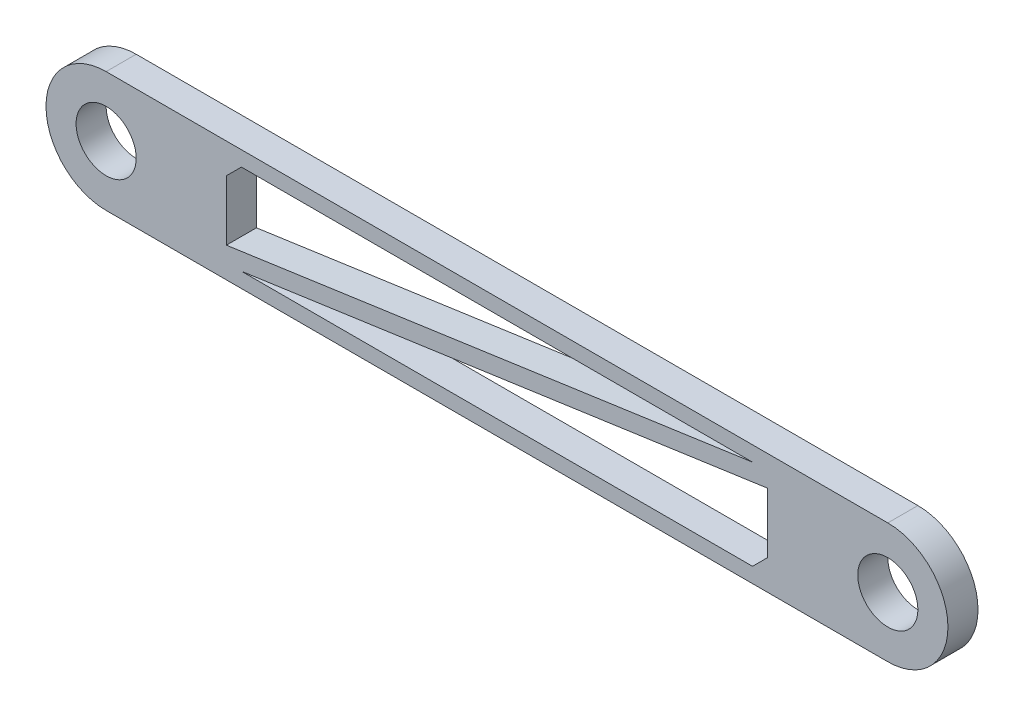
ISO-10303-21;
HEADER;
FILE_DESCRIPTION(('STEP AP214'),'2;1');
FILE_NAME('part.step','',(''),(''),'','','');
FILE_SCHEMA(('AUTOMOTIVE_DESIGN { 1 0 10303 214 1 1 1 1 }'));
ENDSEC;
DATA;
#1=APPLICATION_CONTEXT('core data for automotive mechanical design processes');
#2=APPLICATION_PROTOCOL_DEFINITION('international standard','automotive_design',2000,#1);
#3=PRODUCT_CONTEXT('',#1,'mechanical');
#4=PRODUCT('Part','Part','',(#3));
#5=PRODUCT_RELATED_PRODUCT_CATEGORY('part','',(#4));
#6=PRODUCT_DEFINITION_FORMATION('','',#4);
#7=PRODUCT_DEFINITION_CONTEXT('part definition',#1,'design');
#8=PRODUCT_DEFINITION('design','',#6,#7);
#9=PRODUCT_DEFINITION_SHAPE('','',#8);
#10=(LENGTH_UNIT() NAMED_UNIT(*) SI_UNIT(.MILLI.,.METRE.));
#11=(NAMED_UNIT(*) PLANE_ANGLE_UNIT() SI_UNIT($,.RADIAN.));
#12=(NAMED_UNIT(*) SI_UNIT($,.STERADIAN.) SOLID_ANGLE_UNIT());
#13=UNCERTAINTY_MEASURE_WITH_UNIT(LENGTH_MEASURE(1.E-05),#10,'distance_accuracy_value','');
#14=(GEOMETRIC_REPRESENTATION_CONTEXT(3) GLOBAL_UNCERTAINTY_ASSIGNED_CONTEXT((#13)) GLOBAL_UNIT_ASSIGNED_CONTEXT((#10,
#11,#12)) REPRESENTATION_CONTEXT('',''));
#15=CARTESIAN_POINT('',(0.,0.,0.));
#16=DIRECTION('',(0.,0.,1.));
#17=DIRECTION('',(1.,0.,0.));
#18=AXIS2_PLACEMENT_3D('',#15,#16,#17);
#19=CARTESIAN_POINT('',(-130.,0.,10.));
#20=DIRECTION('',(0.,0.,1.));
#21=DIRECTION('',(1.,0.,0.));
#22=AXIS2_PLACEMENT_3D('',#19,#20,#21);
#23=PLANE('',#22);
#24=CARTESIAN_POINT('',(130.,0.,10.));
#25=DIRECTION('',(0.,0.,1.));
#26=DIRECTION('',(1.,0.,0.));
#27=AXIS2_PLACEMENT_3D('',#24,#25,#26);
#28=CIRCLE('',#27,10.);
#29=CARTESIAN_POINT('',(140.,0.,10.));
#30=VERTEX_POINT('',#29);
#31=EDGE_CURVE('E159',#30,#30,#28,.T.);
#32=ORIENTED_EDGE('',*,*,#31,.F.);
#33=EDGE_LOOP('',(#32));
#34=FACE_BOUND('',#33,.T.);
#35=CARTESIAN_POINT('',(-130.,0.,10.));
#36=DIRECTION('',(0.,0.,1.));
#37=DIRECTION('',(1.,0.,0.));
#38=AXIS2_PLACEMENT_3D('',#35,#36,#37);
#39=CIRCLE('',#38,20.);
#40=CARTESIAN_POINT('',(-130.,20.,10.));
#41=VERTEX_POINT('',#40);
#42=CARTESIAN_POINT('',(-130.,-20.,10.));
#43=VERTEX_POINT('',#42);
#44=EDGE_CURVE('E200',#41,#43,#39,.T.);
#45=ORIENTED_EDGE('',*,*,#44,.T.);
#46=DIRECTION('',(1.,0.,0.));
#47=VECTOR('',#46,1.);
#48=CARTESIAN_POINT('',(-130.,-20.,10.));
#49=LINE('',#48,#47);
#50=CARTESIAN_POINT('',(130.,-20.,10.));
#51=VERTEX_POINT('',#50);
#52=EDGE_CURVE('E203',#43,#51,#49,.T.);
#53=ORIENTED_EDGE('',*,*,#52,.T.);
#54=CARTESIAN_POINT('',(130.,0.,10.));
#55=DIRECTION('',(0.,0.,1.));
#56=DIRECTION('',(1.,0.,0.));
#57=AXIS2_PLACEMENT_3D('',#54,#55,#56);
#58=CIRCLE('',#57,20.);
#59=CARTESIAN_POINT('',(130.,20.,10.));
#60=VERTEX_POINT('',#59);
#61=EDGE_CURVE('E206',#51,#60,#58,.T.);
#62=ORIENTED_EDGE('',*,*,#61,.T.);
#63=DIRECTION('',(-1.,0.,0.));
#64=VECTOR('',#63,1.);
#65=CARTESIAN_POINT('',(-130.,20.,10.));
#66=LINE('',#65,#64);
#67=EDGE_CURVE('E208',#60,#41,#66,.T.);
#68=ORIENTED_EDGE('',*,*,#67,.T.);
#69=EDGE_LOOP('',(#45,#53,#62,#68));
#70=FACE_BOUND('',#69,.T.);
#71=DIRECTION('',(0.989949493661167,0.141421356237309,0.));
#72=VECTOR('',#71,1.);
#73=CARTESIAN_POINT('',(85.,15.,10.));
#74=LINE('',#73,#72);
#75=CARTESIAN_POINT('',(-90.0000000000001,-10.,10.));
#76=VERTEX_POINT('',#75);
#77=CARTESIAN_POINT('',(85.,15.,10.));
#78=VERTEX_POINT('',#77);
#79=EDGE_CURVE('E171',#76,#78,#74,.T.);
#80=ORIENTED_EDGE('',*,*,#79,.F.);
#81=DIRECTION('',(0.,-1.,0.));
#82=VECTOR('',#81,1.);
#83=CARTESIAN_POINT('',(-90.0000000000001,-10.,10.));
#84=LINE('',#83,#82);
#85=CARTESIAN_POINT('',(-90.0000000000001,9.99999999999999,10.));
#86=VERTEX_POINT('',#85);
#87=EDGE_CURVE('E169',#86,#76,#84,.T.);
#88=ORIENTED_EDGE('',*,*,#87,.F.);
#89=DIRECTION('',(-0.707106781186548,-0.707106781186547,0.));
#90=VECTOR('',#89,1.);
#91=CARTESIAN_POINT('',(-90.0000000000001,9.99999999999999,10.));
#92=LINE('',#91,#90);
#93=CARTESIAN_POINT('',(-85.,15.,10.));
#94=VERTEX_POINT('',#93);
#95=EDGE_CURVE('E177',#94,#86,#92,.T.);
#96=ORIENTED_EDGE('',*,*,#95,.F.);
#97=DIRECTION('',(-1.,0.,0.));
#98=VECTOR('',#97,1.);
#99=CARTESIAN_POINT('',(-85.,15.,10.));
#100=LINE('',#99,#98);
#101=EDGE_CURVE('E174',#78,#94,#100,.T.);
#102=ORIENTED_EDGE('',*,*,#101,.F.);
#103=EDGE_LOOP('',(#80,#88,#96,#102));
#104=FACE_BOUND('',#103,.T.);
#105=DIRECTION('',(1.,0.,0.));
#106=VECTOR('',#105,1.);
#107=CARTESIAN_POINT('',(-85.,-15.,10.));
#108=LINE('',#107,#106);
#109=CARTESIAN_POINT('',(-85.,-15.,10.));
#110=VERTEX_POINT('',#109);
#111=CARTESIAN_POINT('',(85.,-15.,10.));
#112=VERTEX_POINT('',#111);
#113=EDGE_CURVE('E138',#110,#112,#108,.T.);
#114=ORIENTED_EDGE('',*,*,#113,.F.);
#115=DIRECTION('',(-0.989949493661167,-0.141421356237309,0.));
#116=VECTOR('',#115,1.);
#117=CARTESIAN_POINT('',(-85.,-15.,10.));
#118=LINE('',#117,#116);
#119=CARTESIAN_POINT('',(90.,9.99999999999999,10.));
#120=VERTEX_POINT('',#119);
#121=EDGE_CURVE('E130',#120,#110,#118,.T.);
#122=ORIENTED_EDGE('',*,*,#121,.F.);
#123=DIRECTION('',(0.,1.,0.));
#124=VECTOR('',#123,1.);
#125=CARTESIAN_POINT('',(90.,-10.,10.));
#126=LINE('',#125,#124);
#127=CARTESIAN_POINT('',(90.,-10.,10.));
#128=VERTEX_POINT('',#127);
#129=EDGE_CURVE('E153',#128,#120,#126,.T.);
#130=ORIENTED_EDGE('',*,*,#129,.F.);
#131=DIRECTION('',(0.707106781186548,0.707106781186547,0.));
#132=VECTOR('',#131,1.);
#133=CARTESIAN_POINT('',(85.,-15.,10.));
#134=LINE('',#133,#132);
#135=EDGE_CURVE('E151',#112,#128,#134,.T.);
#136=ORIENTED_EDGE('',*,*,#135,.F.);
#137=EDGE_LOOP('',(#114,#122,#130,#136));
#138=FACE_BOUND('',#137,.T.);
#139=CARTESIAN_POINT('',(-130.,0.,10.));
#140=DIRECTION('',(0.,0.,1.));
#141=DIRECTION('',(1.,0.,0.));
#142=AXIS2_PLACEMENT_3D('',#139,#140,#141);
#143=CIRCLE('',#142,9.99999999999999);
#144=CARTESIAN_POINT('',(-120.,0.,10.));
#145=VERTEX_POINT('',#144);
#146=EDGE_CURVE('E317',#145,#145,#143,.T.);
#147=ORIENTED_EDGE('',*,*,#146,.F.);
#148=EDGE_LOOP('',(#147));
#149=FACE_BOUND('',#148,.T.);
#150=ADVANCED_FACE('F41',(#34,#70,#104,#138,#149),#23,.T.);
#151=CARTESIAN_POINT('',(-130.,0.,0.));
#152=DIRECTION('',(0.,0.,1.));
#153=DIRECTION('',(1.,0.,0.));
#154=AXIS2_PLACEMENT_3D('',#151,#152,#153);
#155=PLANE('',#154);
#156=DIRECTION('',(0.,-1.,0.));
#157=VECTOR('',#156,1.);
#158=CARTESIAN_POINT('',(-90.0000000000001,-10.,0.));
#159=LINE('',#158,#157);
#160=CARTESIAN_POINT('',(-90.0000000000001,10.,0.));
#161=VERTEX_POINT('',#160);
#162=CARTESIAN_POINT('',(-90.0000000000001,-10.,0.));
#163=VERTEX_POINT('',#162);
#164=EDGE_CURVE('E146',#161,#163,#159,.T.);
#165=ORIENTED_EDGE('',*,*,#164,.T.);
#166=DIRECTION('',(0.989949493661167,0.141421356237309,0.));
#167=VECTOR('',#166,1.);
#168=CARTESIAN_POINT('',(85.,15.,0.));
#169=LINE('',#168,#167);
#170=CARTESIAN_POINT('',(85.,15.,0.));
#171=VERTEX_POINT('',#170);
#172=EDGE_CURVE('E182',#163,#171,#169,.T.);
#173=ORIENTED_EDGE('',*,*,#172,.T.);
#174=DIRECTION('',(-1.,0.,0.));
#175=VECTOR('',#174,1.);
#176=CARTESIAN_POINT('',(-85.,15.,0.));
#177=LINE('',#176,#175);
#178=CARTESIAN_POINT('',(-85.,15.,0.));
#179=VERTEX_POINT('',#178);
#180=EDGE_CURVE('E185',#171,#179,#177,.T.);
#181=ORIENTED_EDGE('',*,*,#180,.T.);
#182=DIRECTION('',(-0.707106781186548,-0.707106781186547,0.));
#183=VECTOR('',#182,1.);
#184=CARTESIAN_POINT('',(-90.0000000000001,9.99999999999999,0.));
#185=LINE('',#184,#183);
#186=EDGE_CURVE('E172',#179,#161,#185,.T.);
#187=ORIENTED_EDGE('',*,*,#186,.T.);
#188=EDGE_LOOP('',(#165,#173,#181,#187));
#189=FACE_BOUND('',#188,.T.);
#190=CARTESIAN_POINT('',(-130.,0.,0.));
#191=DIRECTION('',(0.,0.,1.));
#192=DIRECTION('',(1.,0.,0.));
#193=AXIS2_PLACEMENT_3D('',#190,#191,#192);
#194=CIRCLE('',#193,20.);
#195=CARTESIAN_POINT('',(-130.,20.,0.));
#196=VERTEX_POINT('',#195);
#197=CARTESIAN_POINT('',(-130.,-20.,0.));
#198=VERTEX_POINT('',#197);
#199=EDGE_CURVE('E199',#196,#198,#194,.T.);
#200=ORIENTED_EDGE('',*,*,#199,.F.);
#201=DIRECTION('',(-1.,0.,0.));
#202=VECTOR('',#201,1.);
#203=CARTESIAN_POINT('',(-130.,20.,0.));
#204=LINE('',#203,#202);
#205=CARTESIAN_POINT('',(130.,20.,0.));
#206=VERTEX_POINT('',#205);
#207=EDGE_CURVE('E204',#206,#196,#204,.T.);
#208=ORIENTED_EDGE('',*,*,#207,.F.);
#209=CARTESIAN_POINT('',(130.,0.,0.));
#210=DIRECTION('',(0.,0.,1.));
#211=DIRECTION('',(1.,0.,0.));
#212=AXIS2_PLACEMENT_3D('',#209,#210,#211);
#213=CIRCLE('',#212,20.);
#214=CARTESIAN_POINT('',(130.,-20.,0.));
#215=VERTEX_POINT('',#214);
#216=EDGE_CURVE('E215',#215,#206,#213,.T.);
#217=ORIENTED_EDGE('',*,*,#216,.F.);
#218=DIRECTION('',(1.,0.,0.));
#219=VECTOR('',#218,1.);
#220=CARTESIAN_POINT('',(-130.,-20.,0.));
#221=LINE('',#220,#219);
#222=EDGE_CURVE('E213',#198,#215,#221,.T.);
#223=ORIENTED_EDGE('',*,*,#222,.F.);
#224=EDGE_LOOP('',(#200,#208,#217,#223));
#225=FACE_BOUND('',#224,.T.);
#226=DIRECTION('',(-0.989949493661167,-0.141421356237309,0.));
#227=VECTOR('',#226,1.);
#228=CARTESIAN_POINT('',(-85.,-15.,0.));
#229=LINE('',#228,#227);
#230=CARTESIAN_POINT('',(90.,9.99999999999999,0.));
#231=VERTEX_POINT('',#230);
#232=CARTESIAN_POINT('',(-85.,-15.,0.));
#233=VERTEX_POINT('',#232);
#234=EDGE_CURVE('E64',#231,#233,#229,.T.);
#235=ORIENTED_EDGE('',*,*,#234,.T.);
#236=DIRECTION('',(1.,0.,0.));
#237=VECTOR('',#236,1.);
#238=CARTESIAN_POINT('',(-85.,-15.,0.));
#239=LINE('',#238,#237);
#240=CARTESIAN_POINT('',(85.,-15.,0.));
#241=VERTEX_POINT('',#240);
#242=EDGE_CURVE('E145',#233,#241,#239,.T.);
#243=ORIENTED_EDGE('',*,*,#242,.T.);
#244=DIRECTION('',(0.707106781186548,0.707106781186547,0.));
#245=VECTOR('',#244,1.);
#246=CARTESIAN_POINT('',(85.,-15.,0.));
#247=LINE('',#246,#245);
#248=CARTESIAN_POINT('',(90.,-10.,0.));
#249=VERTEX_POINT('',#248);
#250=EDGE_CURVE('E161',#241,#249,#247,.T.);
#251=ORIENTED_EDGE('',*,*,#250,.T.);
#252=DIRECTION('',(0.,1.,0.));
#253=VECTOR('',#252,1.);
#254=CARTESIAN_POINT('',(90.,-10.,0.));
#255=LINE('',#254,#253);
#256=EDGE_CURVE('E139',#249,#231,#255,.T.);
#257=ORIENTED_EDGE('',*,*,#256,.T.);
#258=EDGE_LOOP('',(#235,#243,#251,#257));
#259=FACE_BOUND('',#258,.T.);
#260=CARTESIAN_POINT('',(130.,0.,0.));
#261=DIRECTION('',(0.,0.,1.));
#262=DIRECTION('',(1.,0.,0.));
#263=AXIS2_PLACEMENT_3D('',#260,#261,#262);
#264=CIRCLE('',#263,10.);
#265=CARTESIAN_POINT('',(140.,0.,0.));
#266=VERTEX_POINT('',#265);
#267=EDGE_CURVE('E323',#266,#266,#264,.T.);
#268=ORIENTED_EDGE('',*,*,#267,.T.);
#269=EDGE_LOOP('',(#268));
#270=FACE_BOUND('',#269,.T.);
#271=CARTESIAN_POINT('',(-130.,0.,0.));
#272=DIRECTION('',(0.,0.,1.));
#273=DIRECTION('',(1.,0.,0.));
#274=AXIS2_PLACEMENT_3D('',#271,#272,#273);
#275=CIRCLE('',#274,9.99999999999999);
#276=CARTESIAN_POINT('',(-120.,0.,0.));
#277=VERTEX_POINT('',#276);
#278=EDGE_CURVE('E320',#277,#277,#275,.T.);
#279=ORIENTED_EDGE('',*,*,#278,.T.);
#280=EDGE_LOOP('',(#279));
#281=FACE_BOUND('',#280,.T.);
#282=ADVANCED_FACE('F233',(#189,#225,#259,#270,#281),#155,.F.);
#283=CARTESIAN_POINT('',(-130.,0.,10.));
#284=DIRECTION('',(0.,0.,-1.));
#285=DIRECTION('',(-1.,0.,0.));
#286=AXIS2_PLACEMENT_3D('',#283,#284,#285);
#287=CYLINDRICAL_SURFACE('',#286,20.);
#288=ORIENTED_EDGE('',*,*,#199,.T.);
#289=DIRECTION('',(0.,0.,-1.));
#290=VECTOR('',#289,1.);
#291=CARTESIAN_POINT('',(-130.,-20.,10.));
#292=LINE('',#291,#290);
#293=EDGE_CURVE('E11',#43,#198,#292,.T.);
#294=ORIENTED_EDGE('',*,*,#293,.F.);
#295=ORIENTED_EDGE('',*,*,#44,.F.);
#296=DIRECTION('',(0.,0.,-1.));
#297=VECTOR('',#296,1.);
#298=CARTESIAN_POINT('',(-130.,20.,10.));
#299=LINE('',#298,#297);
#300=EDGE_CURVE('E210',#41,#196,#299,.T.);
#301=ORIENTED_EDGE('',*,*,#300,.T.);
#302=EDGE_LOOP('',(#288,#294,#295,#301));
#303=FACE_BOUND('',#302,.T.);
#304=ADVANCED_FACE('F43',(#303),#287,.T.);
#305=CARTESIAN_POINT('',(-130.,-20.,10.));
#306=DIRECTION('',(0.,1.,0.));
#307=DIRECTION('',(0.,0.,1.));
#308=AXIS2_PLACEMENT_3D('',#305,#306,#307);
#309=PLANE('',#308);
#310=ORIENTED_EDGE('',*,*,#222,.T.);
#311=DIRECTION('',(0.,0.,-1.));
#312=VECTOR('',#311,1.);
#313=CARTESIAN_POINT('',(130.,-20.,10.));
#314=LINE('',#313,#312);
#315=EDGE_CURVE('E49',#51,#215,#314,.T.);
#316=ORIENTED_EDGE('',*,*,#315,.F.);
#317=ORIENTED_EDGE('',*,*,#52,.F.);
#318=ORIENTED_EDGE('',*,*,#293,.T.);
#319=EDGE_LOOP('',(#310,#316,#317,#318));
#320=FACE_BOUND('',#319,.T.);
#321=ADVANCED_FACE('F244',(#320),#309,.F.);
#322=CARTESIAN_POINT('',(130.,0.,10.));
#323=DIRECTION('',(0.,0.,-1.));
#324=DIRECTION('',(-1.,0.,0.));
#325=AXIS2_PLACEMENT_3D('',#322,#323,#324);
#326=CYLINDRICAL_SURFACE('',#325,20.);
#327=ORIENTED_EDGE('',*,*,#216,.T.);
#328=DIRECTION('',(0.,0.,-1.));
#329=VECTOR('',#328,1.);
#330=CARTESIAN_POINT('',(130.,20.,10.));
#331=LINE('',#330,#329);
#332=EDGE_CURVE('E220',#60,#206,#331,.T.);
#333=ORIENTED_EDGE('',*,*,#332,.F.);
#334=ORIENTED_EDGE('',*,*,#61,.F.);
#335=ORIENTED_EDGE('',*,*,#315,.T.);
#336=EDGE_LOOP('',(#327,#333,#334,#335));
#337=FACE_BOUND('',#336,.T.);
#338=ADVANCED_FACE('F227',(#337),#326,.T.);
#339=CARTESIAN_POINT('',(-130.,20.,10.));
#340=DIRECTION('',(0.,-1.,0.));
#341=DIRECTION('',(0.,0.,-1.));
#342=AXIS2_PLACEMENT_3D('',#339,#340,#341);
#343=PLANE('',#342);
#344=ORIENTED_EDGE('',*,*,#207,.T.);
#345=ORIENTED_EDGE('',*,*,#300,.F.);
#346=ORIENTED_EDGE('',*,*,#67,.F.);
#347=ORIENTED_EDGE('',*,*,#332,.T.);
#348=EDGE_LOOP('',(#344,#345,#346,#347));
#349=FACE_BOUND('',#348,.T.);
#350=ADVANCED_FACE('F237',(#349),#343,.F.);
#351=CARTESIAN_POINT('',(-90.0000000000001,-10.,10.));
#352=DIRECTION('',(1.,0.,0.));
#353=DIRECTION('',(0.,0.,-1.));
#354=AXIS2_PLACEMENT_3D('',#351,#352,#353);
#355=PLANE('',#354);
#356=ORIENTED_EDGE('',*,*,#164,.F.);
#357=DIRECTION('',(0.,0.,-1.));
#358=VECTOR('',#357,1.);
#359=CARTESIAN_POINT('',(-90.0000000000001,9.99999999999999,10.));
#360=LINE('',#359,#358);
#361=EDGE_CURVE('E179',#86,#161,#360,.T.);
#362=ORIENTED_EDGE('',*,*,#361,.F.);
#363=ORIENTED_EDGE('',*,*,#87,.T.);
#364=DIRECTION('',(0.,0.,-1.));
#365=VECTOR('',#364,1.);
#366=CARTESIAN_POINT('',(-90.0000000000001,-10.,10.));
#367=LINE('',#366,#365);
#368=EDGE_CURVE('E196',#76,#163,#367,.T.);
#369=ORIENTED_EDGE('',*,*,#368,.T.);
#370=EDGE_LOOP('',(#356,#362,#363,#369));
#371=FACE_BOUND('',#370,.T.);
#372=ADVANCED_FACE('F261',(#371),#355,.T.);
#373=CARTESIAN_POINT('',(85.,15.,10.));
#374=DIRECTION('',(-0.141421356237309,0.989949493661167,0.));
#375=DIRECTION('',(-0.989949493661167,-0.141421356237309,0.));
#376=AXIS2_PLACEMENT_3D('',#373,#374,#375);
#377=PLANE('',#376);
#378=ORIENTED_EDGE('',*,*,#172,.F.);
#379=ORIENTED_EDGE('',*,*,#368,.F.);
#380=ORIENTED_EDGE('',*,*,#79,.T.);
#381=DIRECTION('',(0.,0.,-1.));
#382=VECTOR('',#381,1.);
#383=CARTESIAN_POINT('',(85.,15.,10.));
#384=LINE('',#383,#382);
#385=EDGE_CURVE('E194',#78,#171,#384,.T.);
#386=ORIENTED_EDGE('',*,*,#385,.T.);
#387=EDGE_LOOP('',(#378,#379,#380,#386));
#388=FACE_BOUND('',#387,.T.);
#389=ADVANCED_FACE('F268',(#388),#377,.T.);
#390=CARTESIAN_POINT('',(-85.,15.,10.));
#391=DIRECTION('',(0.,-1.,0.));
#392=DIRECTION('',(0.,0.,-1.));
#393=AXIS2_PLACEMENT_3D('',#390,#391,#392);
#394=PLANE('',#393);
#395=ORIENTED_EDGE('',*,*,#180,.F.);
#396=ORIENTED_EDGE('',*,*,#385,.F.);
#397=ORIENTED_EDGE('',*,*,#101,.T.);
#398=DIRECTION('',(0.,0.,-1.));
#399=VECTOR('',#398,1.);
#400=CARTESIAN_POINT('',(-85.,15.,10.));
#401=LINE('',#400,#399);
#402=EDGE_CURVE('E192',#94,#179,#401,.T.);
#403=ORIENTED_EDGE('',*,*,#402,.T.);
#404=EDGE_LOOP('',(#395,#396,#397,#403));
#405=FACE_BOUND('',#404,.T.);
#406=ADVANCED_FACE('F273',(#405),#394,.T.);
#407=CARTESIAN_POINT('',(-90.0000000000001,9.99999999999999,10.));
#408=DIRECTION('',(0.707106781186547,-0.707106781186548,0.));
#409=DIRECTION('',(0.707106781186548,0.707106781186547,0.));
#410=AXIS2_PLACEMENT_3D('',#407,#408,#409);
#411=PLANE('',#410);
#412=ORIENTED_EDGE('',*,*,#186,.F.);
#413=ORIENTED_EDGE('',*,*,#402,.F.);
#414=ORIENTED_EDGE('',*,*,#95,.T.);
#415=ORIENTED_EDGE('',*,*,#361,.T.);
#416=EDGE_LOOP('',(#412,#413,#414,#415));
#417=FACE_BOUND('',#416,.T.);
#418=ADVANCED_FACE('F280',(#417),#411,.T.);
#419=CARTESIAN_POINT('',(-85.,-15.,10.));
#420=DIRECTION('',(0.141421356237309,-0.989949493661167,0.));
#421=DIRECTION('',(0.989949493661167,0.141421356237309,0.));
#422=AXIS2_PLACEMENT_3D('',#419,#420,#421);
#423=PLANE('',#422);
#424=ORIENTED_EDGE('',*,*,#234,.F.);
#425=DIRECTION('',(0.,0.,-1.));
#426=VECTOR('',#425,1.);
#427=CARTESIAN_POINT('',(90.,9.99999999999999,10.));
#428=LINE('',#427,#426);
#429=EDGE_CURVE('E134',#120,#231,#428,.T.);
#430=ORIENTED_EDGE('',*,*,#429,.F.);
#431=ORIENTED_EDGE('',*,*,#121,.T.);
#432=DIRECTION('',(0.,0.,-1.));
#433=VECTOR('',#432,1.);
#434=CARTESIAN_POINT('',(-85.,-15.,10.));
#435=LINE('',#434,#433);
#436=EDGE_CURVE('E133',#110,#233,#435,.T.);
#437=ORIENTED_EDGE('',*,*,#436,.T.);
#438=EDGE_LOOP('',(#424,#430,#431,#437));
#439=FACE_BOUND('',#438,.T.);
#440=ADVANCED_FACE('F132',(#439),#423,.T.);
#441=CARTESIAN_POINT('',(-85.,-15.,10.));
#442=DIRECTION('',(0.,1.,0.));
#443=DIRECTION('',(0.,0.,1.));
#444=AXIS2_PLACEMENT_3D('',#441,#442,#443);
#445=PLANE('',#444);
#446=ORIENTED_EDGE('',*,*,#242,.F.);
#447=ORIENTED_EDGE('',*,*,#436,.F.);
#448=ORIENTED_EDGE('',*,*,#113,.T.);
#449=DIRECTION('',(0.,0.,-1.));
#450=VECTOR('',#449,1.);
#451=CARTESIAN_POINT('',(85.,-15.,10.));
#452=LINE('',#451,#450);
#453=EDGE_CURVE('E147',#112,#241,#452,.T.);
#454=ORIENTED_EDGE('',*,*,#453,.T.);
#455=EDGE_LOOP('',(#446,#447,#448,#454));
#456=FACE_BOUND('',#455,.T.);
#457=ADVANCED_FACE('F142',(#456),#445,.T.);
#458=CARTESIAN_POINT('',(85.,-15.,10.));
#459=DIRECTION('',(-0.707106781186547,0.707106781186548,0.));
#460=DIRECTION('',(-0.707106781186548,-0.707106781186547,0.));
#461=AXIS2_PLACEMENT_3D('',#458,#459,#460);
#462=PLANE('',#461);
#463=ORIENTED_EDGE('',*,*,#250,.F.);
#464=ORIENTED_EDGE('',*,*,#453,.F.);
#465=ORIENTED_EDGE('',*,*,#135,.T.);
#466=DIRECTION('',(0.,0.,-1.));
#467=VECTOR('',#466,1.);
#468=CARTESIAN_POINT('',(90.,-10.,10.));
#469=LINE('',#468,#467);
#470=EDGE_CURVE('E56',#128,#249,#469,.T.);
#471=ORIENTED_EDGE('',*,*,#470,.T.);
#472=EDGE_LOOP('',(#463,#464,#465,#471));
#473=FACE_BOUND('',#472,.T.);
#474=ADVANCED_FACE('F298',(#473),#462,.T.);
#475=CARTESIAN_POINT('',(90.,-10.,10.));
#476=DIRECTION('',(-1.,0.,0.));
#477=DIRECTION('',(0.,0.,1.));
#478=AXIS2_PLACEMENT_3D('',#475,#476,#477);
#479=PLANE('',#478);
#480=ORIENTED_EDGE('',*,*,#256,.F.);
#481=ORIENTED_EDGE('',*,*,#470,.F.);
#482=ORIENTED_EDGE('',*,*,#129,.T.);
#483=ORIENTED_EDGE('',*,*,#429,.T.);
#484=EDGE_LOOP('',(#480,#481,#482,#483));
#485=FACE_BOUND('',#484,.T.);
#486=ADVANCED_FACE('F301',(#485),#479,.T.);
#487=CARTESIAN_POINT('',(130.,0.,10.));
#488=DIRECTION('',(0.,0.,-1.));
#489=DIRECTION('',(-1.,0.,0.));
#490=AXIS2_PLACEMENT_3D('',#487,#488,#489);
#491=CYLINDRICAL_SURFACE('',#490,10.);
#492=ORIENTED_EDGE('',*,*,#31,.T.);
#493=EDGE_LOOP('',(#492));
#494=FACE_BOUND('',#493,.T.);
#495=ORIENTED_EDGE('',*,*,#267,.F.);
#496=EDGE_LOOP('',(#495));
#497=FACE_BOUND('',#496,.T.);
#498=ADVANCED_FACE('F305',(#494,#497),#491,.F.);
#499=CARTESIAN_POINT('',(-130.,0.,10.));
#500=DIRECTION('',(0.,0.,-1.));
#501=DIRECTION('',(-1.,0.,0.));
#502=AXIS2_PLACEMENT_3D('',#499,#500,#501);
#503=CYLINDRICAL_SURFACE('',#502,9.99999999999999);
#504=ORIENTED_EDGE('',*,*,#146,.T.);
#505=EDGE_LOOP('',(#504));
#506=FACE_BOUND('',#505,.T.);
#507=ORIENTED_EDGE('',*,*,#278,.F.);
#508=EDGE_LOOP('',(#507));
#509=FACE_BOUND('',#508,.T.);
#510=ADVANCED_FACE('F308',(#506,#509),#503,.F.);
#511=CLOSED_SHELL('',(#150,#282,#304,#321,#338,#350,#372,#389,#406,#418,#440,#457,#474,#486,
#498,#510));
#512=MANIFOLD_SOLID_BREP('B2',#511);
#513=ADVANCED_BREP_SHAPE_REPRESENTATION('',(#18,#512),#14);
#514=SHAPE_DEFINITION_REPRESENTATION(#9,#513);
ENDSEC;
END-ISO-10303-21;
